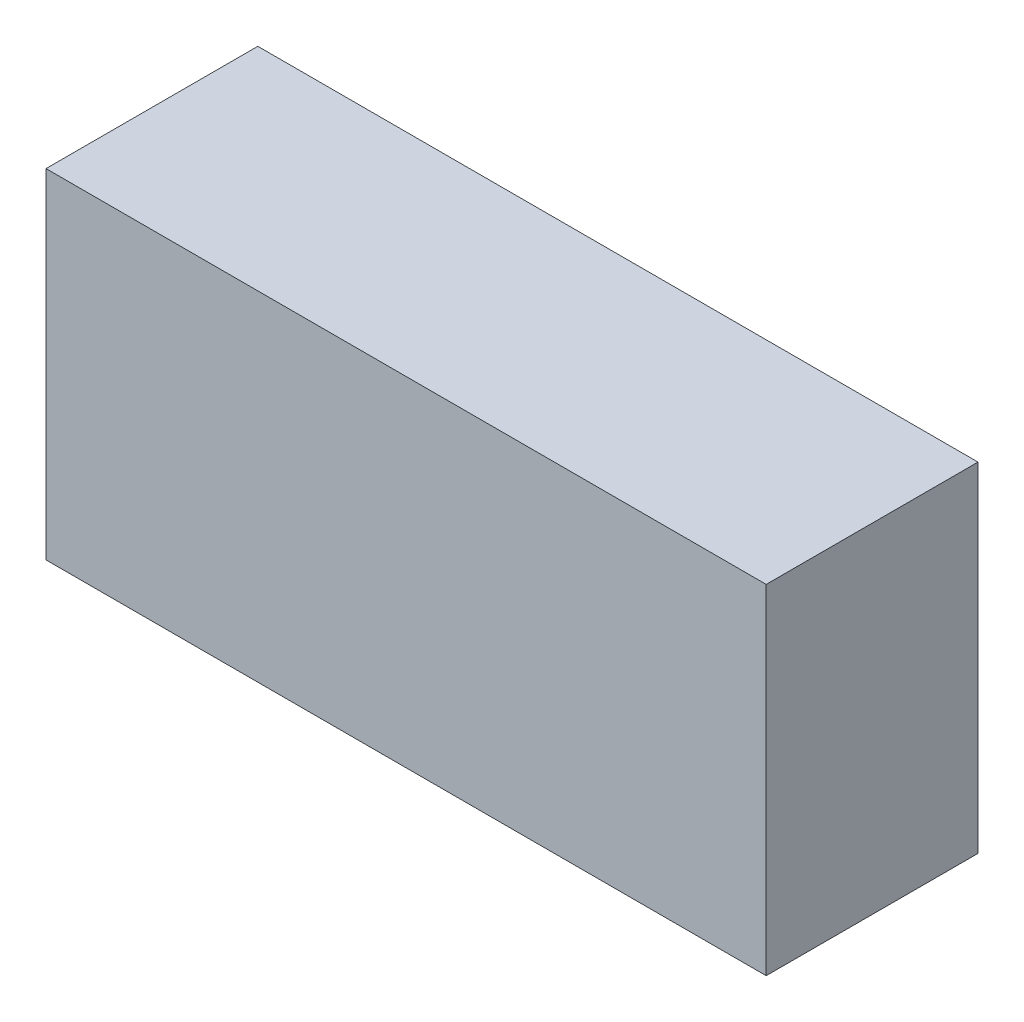
ISO-10303-21;
HEADER;
FILE_DESCRIPTION(('STEP AP214'),'2;1');
FILE_NAME('part.step','',(''),(''),'','','');
FILE_SCHEMA(('AUTOMOTIVE_DESIGN { 1 0 10303 214 1 1 1 1 }'));
ENDSEC;
DATA;
#1=APPLICATION_CONTEXT('core data for automotive mechanical design processes');
#2=APPLICATION_PROTOCOL_DEFINITION('international standard','automotive_design',2000,#1);
#3=PRODUCT_CONTEXT('',#1,'mechanical');
#4=PRODUCT('Part','Part','',(#3));
#5=PRODUCT_RELATED_PRODUCT_CATEGORY('part','',(#4));
#6=PRODUCT_DEFINITION_FORMATION('','',#4);
#7=PRODUCT_DEFINITION_CONTEXT('part definition',#1,'design');
#8=PRODUCT_DEFINITION('design','',#6,#7);
#9=PRODUCT_DEFINITION_SHAPE('','',#8);
#10=(LENGTH_UNIT() NAMED_UNIT(*) SI_UNIT(.MILLI.,.METRE.));
#11=(NAMED_UNIT(*) PLANE_ANGLE_UNIT() SI_UNIT($,.RADIAN.));
#12=(NAMED_UNIT(*) SI_UNIT($,.STERADIAN.) SOLID_ANGLE_UNIT());
#13=UNCERTAINTY_MEASURE_WITH_UNIT(LENGTH_MEASURE(1.E-05),#10,'distance_accuracy_value','');
#14=(GEOMETRIC_REPRESENTATION_CONTEXT(3) GLOBAL_UNCERTAINTY_ASSIGNED_CONTEXT((#13)) GLOBAL_UNIT_ASSIGNED_CONTEXT((#10,
#11,#12)) REPRESENTATION_CONTEXT('',''));
#15=CARTESIAN_POINT('',(0.,0.,0.));
#16=DIRECTION('',(0.,0.,1.));
#17=DIRECTION('',(1.,0.,0.));
#18=AXIS2_PLACEMENT_3D('',#15,#16,#17);
#19=CARTESIAN_POINT('',(0.,0.,0.5));
#20=DIRECTION('',(0.,0.,1.));
#21=DIRECTION('',(1.,0.,0.));
#22=AXIS2_PLACEMENT_3D('',#19,#20,#21);
#23=PLANE('',#22);
#24=DIRECTION('',(1.,0.,0.));
#25=VECTOR('',#24,1.);
#26=CARTESIAN_POINT('',(-0.85,-0.4,0.5));
#27=LINE('',#26,#25);
#28=CARTESIAN_POINT('',(-0.85,-0.4,0.5));
#29=VERTEX_POINT('',#28);
#30=CARTESIAN_POINT('',(0.85,-0.4,0.5));
#31=VERTEX_POINT('',#30);
#32=EDGE_CURVE('E74',#29,#31,#27,.T.);
#33=ORIENTED_EDGE('',*,*,#32,.T.);
#34=DIRECTION('',(0.,1.,0.));
#35=VECTOR('',#34,1.);
#36=CARTESIAN_POINT('',(0.85,-0.4,0.5));
#37=LINE('',#36,#35);
#38=CARTESIAN_POINT('',(0.85,0.4,0.5));
#39=VERTEX_POINT('',#38);
#40=EDGE_CURVE('E79',#31,#39,#37,.T.);
#41=ORIENTED_EDGE('',*,*,#40,.T.);
#42=DIRECTION('',(-1.,0.,0.));
#43=VECTOR('',#42,1.);
#44=CARTESIAN_POINT('',(0.85,0.4,0.5));
#45=LINE('',#44,#43);
#46=CARTESIAN_POINT('',(-0.85,0.4,0.5));
#47=VERTEX_POINT('',#46);
#48=EDGE_CURVE('E104',#39,#47,#45,.T.);
#49=ORIENTED_EDGE('',*,*,#48,.T.);
#50=DIRECTION('',(0.,-1.,0.));
#51=VECTOR('',#50,1.);
#52=CARTESIAN_POINT('',(-0.85,0.4,0.5));
#53=LINE('',#52,#51);
#54=EDGE_CURVE('E11',#47,#29,#53,.T.);
#55=ORIENTED_EDGE('',*,*,#54,.T.);
#56=EDGE_LOOP('',(#33,#41,#49,#55));
#57=FACE_BOUND('',#56,.T.);
#58=ADVANCED_FACE('F16',(#57),#23,.T.);
#59=CARTESIAN_POINT('',(0.,0.,0.));
#60=DIRECTION('',(0.,0.,1.));
#61=DIRECTION('',(1.,0.,0.));
#62=AXIS2_PLACEMENT_3D('',#59,#60,#61);
#63=PLANE('',#62);
#64=DIRECTION('',(1.,0.,0.));
#65=VECTOR('',#64,1.);
#66=CARTESIAN_POINT('',(-0.85,-0.4,0.));
#67=LINE('',#66,#65);
#68=CARTESIAN_POINT('',(-0.85,-0.4,0.));
#69=VERTEX_POINT('',#68);
#70=CARTESIAN_POINT('',(0.85,-0.4,0.));
#71=VERTEX_POINT('',#70);
#72=EDGE_CURVE('E65',#69,#71,#67,.T.);
#73=ORIENTED_EDGE('',*,*,#72,.F.);
#74=DIRECTION('',(0.,-1.,0.));
#75=VECTOR('',#74,1.);
#76=CARTESIAN_POINT('',(-0.85,0.4,0.));
#77=LINE('',#76,#75);
#78=CARTESIAN_POINT('',(-0.85,0.4,0.));
#79=VERTEX_POINT('',#78);
#80=EDGE_CURVE('E26',#79,#69,#77,.T.);
#81=ORIENTED_EDGE('',*,*,#80,.F.);
#82=DIRECTION('',(-1.,0.,0.));
#83=VECTOR('',#82,1.);
#84=CARTESIAN_POINT('',(0.85,0.4,0.));
#85=LINE('',#84,#83);
#86=CARTESIAN_POINT('',(0.85,0.4,0.));
#87=VERTEX_POINT('',#86);
#88=EDGE_CURVE('E68',#87,#79,#85,.T.);
#89=ORIENTED_EDGE('',*,*,#88,.F.);
#90=DIRECTION('',(0.,1.,0.));
#91=VECTOR('',#90,1.);
#92=CARTESIAN_POINT('',(0.85,-0.4,0.));
#93=LINE('',#92,#91);
#94=EDGE_CURVE('E19',#71,#87,#93,.T.);
#95=ORIENTED_EDGE('',*,*,#94,.F.);
#96=EDGE_LOOP('',(#73,#81,#89,#95));
#97=FACE_BOUND('',#96,.T.);
#98=ADVANCED_FACE('F63',(#97),#63,.F.);
#99=CARTESIAN_POINT('',(-0.85,0.4,0.));
#100=DIRECTION('',(1.,0.,0.));
#101=DIRECTION('',(0.,1.,0.));
#102=AXIS2_PLACEMENT_3D('',#99,#100,#101);
#103=PLANE('',#102);
#104=DIRECTION('',(0.,0.,1.));
#105=VECTOR('',#104,1.);
#106=CARTESIAN_POINT('',(-0.85,0.4,0.));
#107=LINE('',#106,#105);
#108=EDGE_CURVE('E100',#79,#47,#107,.T.);
#109=ORIENTED_EDGE('',*,*,#108,.F.);
#110=ORIENTED_EDGE('',*,*,#80,.T.);
#111=DIRECTION('',(0.,0.,1.));
#112=VECTOR('',#111,1.);
#113=CARTESIAN_POINT('',(-0.85,-0.4,0.));
#114=LINE('',#113,#112);
#115=EDGE_CURVE('E86',#69,#29,#114,.T.);
#116=ORIENTED_EDGE('',*,*,#115,.T.);
#117=ORIENTED_EDGE('',*,*,#54,.F.);
#118=EDGE_LOOP('',(#109,#110,#116,#117));
#119=FACE_BOUND('',#118,.T.);
#120=ADVANCED_FACE('F129',(#119),#103,.F.);
#121=CARTESIAN_POINT('',(0.85,0.4,0.));
#122=DIRECTION('',(0.,-1.,0.));
#123=DIRECTION('',(0.,0.,-1.));
#124=AXIS2_PLACEMENT_3D('',#121,#122,#123);
#125=PLANE('',#124);
#126=DIRECTION('',(0.,0.,1.));
#127=VECTOR('',#126,1.);
#128=CARTESIAN_POINT('',(0.85,0.4,0.));
#129=LINE('',#128,#127);
#130=EDGE_CURVE('E73',#87,#39,#129,.T.);
#131=ORIENTED_EDGE('',*,*,#130,.F.);
#132=ORIENTED_EDGE('',*,*,#88,.T.);
#133=ORIENTED_EDGE('',*,*,#108,.T.);
#134=ORIENTED_EDGE('',*,*,#48,.F.);
#135=EDGE_LOOP('',(#131,#132,#133,#134));
#136=FACE_BOUND('',#135,.T.);
#137=ADVANCED_FACE('F109',(#136),#125,.F.);
#138=CARTESIAN_POINT('',(0.85,-0.4,0.));
#139=DIRECTION('',(-1.,0.,0.));
#140=DIRECTION('',(0.,0.,1.));
#141=AXIS2_PLACEMENT_3D('',#138,#139,#140);
#142=PLANE('',#141);
#143=DIRECTION('',(0.,0.,1.));
#144=VECTOR('',#143,1.);
#145=CARTESIAN_POINT('',(0.85,-0.4,0.));
#146=LINE('',#145,#144);
#147=EDGE_CURVE('E76',#71,#31,#146,.T.);
#148=ORIENTED_EDGE('',*,*,#147,.F.);
#149=ORIENTED_EDGE('',*,*,#94,.T.);
#150=ORIENTED_EDGE('',*,*,#130,.T.);
#151=ORIENTED_EDGE('',*,*,#40,.F.);
#152=EDGE_LOOP('',(#148,#149,#150,#151));
#153=FACE_BOUND('',#152,.T.);
#154=ADVANCED_FACE('F77',(#153),#142,.F.);
#155=CARTESIAN_POINT('',(-0.85,-0.4,0.));
#156=DIRECTION('',(0.,1.,0.));
#157=DIRECTION('',(1.,0.,0.));
#158=AXIS2_PLACEMENT_3D('',#155,#156,#157);
#159=PLANE('',#158);
#160=ORIENTED_EDGE('',*,*,#115,.F.);
#161=ORIENTED_EDGE('',*,*,#72,.T.);
#162=ORIENTED_EDGE('',*,*,#147,.T.);
#163=ORIENTED_EDGE('',*,*,#32,.F.);
#164=EDGE_LOOP('',(#160,#161,#162,#163));
#165=FACE_BOUND('',#164,.T.);
#166=ADVANCED_FACE('F85',(#165),#159,.F.);
#167=CLOSED_SHELL('',(#58,#98,#120,#137,#154,#166));
#168=MANIFOLD_SOLID_BREP('B1',#167);
#169=ADVANCED_BREP_SHAPE_REPRESENTATION('',(#18,#168),#14);
#170=SHAPE_DEFINITION_REPRESENTATION(#9,#169);
ENDSEC;
END-ISO-10303-21;
